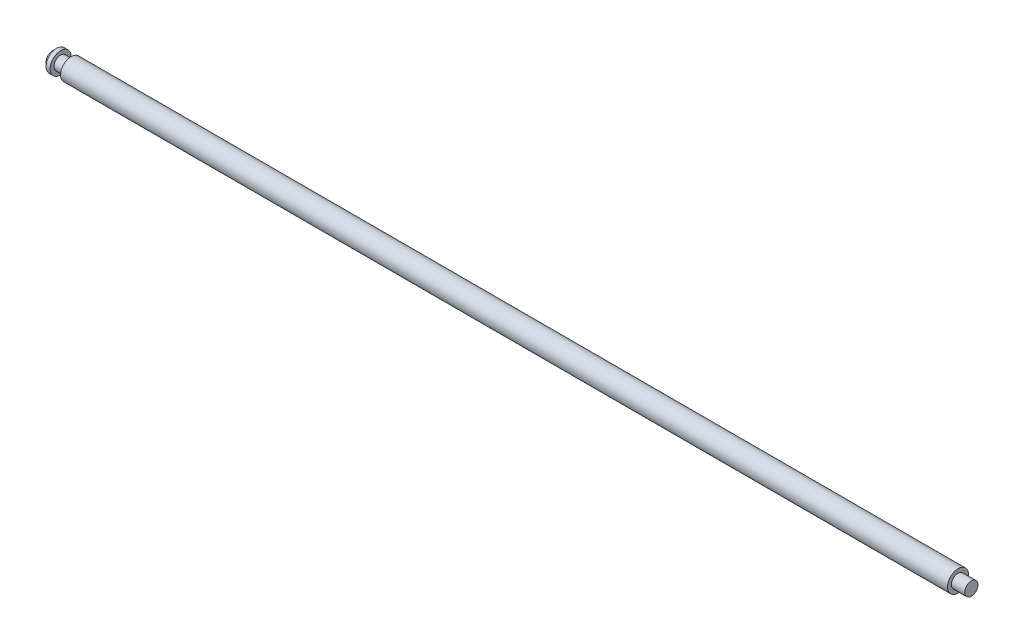
ISO-10303-21;
HEADER;
FILE_DESCRIPTION(('STEP AP214'),'2;1');
FILE_NAME('part.step','',(''),(''),'','','');
FILE_SCHEMA(('AUTOMOTIVE_DESIGN { 1 0 10303 214 1 1 1 1 }'));
ENDSEC;
DATA;
#1=APPLICATION_CONTEXT('core data for automotive mechanical design processes');
#2=APPLICATION_PROTOCOL_DEFINITION('international standard','automotive_design',2000,#1);
#3=PRODUCT_CONTEXT('',#1,'mechanical');
#4=PRODUCT('Part','Part','',(#3));
#5=PRODUCT_RELATED_PRODUCT_CATEGORY('part','',(#4));
#6=PRODUCT_DEFINITION_FORMATION('','',#4);
#7=PRODUCT_DEFINITION_CONTEXT('part definition',#1,'design');
#8=PRODUCT_DEFINITION('design','',#6,#7);
#9=PRODUCT_DEFINITION_SHAPE('','',#8);
#10=(LENGTH_UNIT() NAMED_UNIT(*) SI_UNIT(.MILLI.,.METRE.));
#11=(NAMED_UNIT(*) PLANE_ANGLE_UNIT() SI_UNIT($,.RADIAN.));
#12=(NAMED_UNIT(*) SI_UNIT($,.STERADIAN.) SOLID_ANGLE_UNIT());
#13=UNCERTAINTY_MEASURE_WITH_UNIT(LENGTH_MEASURE(1.E-05),#10,'distance_accuracy_value','');
#14=(GEOMETRIC_REPRESENTATION_CONTEXT(3) GLOBAL_UNCERTAINTY_ASSIGNED_CONTEXT((#13)) GLOBAL_UNIT_ASSIGNED_CONTEXT((#10,
#11,#12)) REPRESENTATION_CONTEXT('',''));
#15=CARTESIAN_POINT('',(0.,0.,0.));
#16=DIRECTION('',(0.,0.,1.));
#17=DIRECTION('',(1.,0.,0.));
#18=AXIS2_PLACEMENT_3D('',#15,#16,#17);
#19=CARTESIAN_POINT('',(-204.15,0.,-3.00000000000003));
#20=DIRECTION('',(1.,0.,0.));
#21=DIRECTION('',(0.,0.,-1.));
#22=AXIS2_PLACEMENT_3D('',#19,#20,#21);
#23=PLANE('',#22);
#24=CARTESIAN_POINT('',(-204.15,0.,0.));
#25=DIRECTION('',(-1.,0.,0.));
#26=DIRECTION('',(0.,0.,1.));
#27=AXIS2_PLACEMENT_3D('',#24,#25,#26);
#28=CIRCLE('',#27,3.00000000000003);
#29=CARTESIAN_POINT('',(-204.15,0.,3.00000000000003));
#30=VERTEX_POINT('',#29);
#31=EDGE_CURVE('E10',#30,#30,#28,.T.);
#32=ORIENTED_EDGE('',*,*,#31,.T.);
#33=EDGE_LOOP('',(#32));
#34=FACE_BOUND('',#33,.T.);
#35=ADVANCED_FACE('F31',(#34),#23,.F.);
#36=CARTESIAN_POINT('',(-204.15,0.,0.));
#37=DIRECTION('',(-1.,0.,0.));
#38=DIRECTION('',(0.,0.,1.));
#39=AXIS2_PLACEMENT_3D('',#36,#37,#38);
#40=CYLINDRICAL_SURFACE('',#39,3.00000000000003);
#41=ORIENTED_EDGE('',*,*,#31,.F.);
#42=EDGE_LOOP('',(#41));
#43=FACE_BOUND('',#42,.T.);
#44=CARTESIAN_POINT('',(-202.4,0.,0.));
#45=DIRECTION('',(-1.,0.,0.));
#46=DIRECTION('',(0.,0.,1.));
#47=AXIS2_PLACEMENT_3D('',#44,#45,#46);
#48=CIRCLE('',#47,3.00000000000003);
#49=CARTESIAN_POINT('',(-202.4,0.,3.00000000000003));
#50=VERTEX_POINT('',#49);
#51=EDGE_CURVE('E37',#50,#50,#48,.T.);
#52=ORIENTED_EDGE('',*,*,#51,.T.);
#53=EDGE_LOOP('',(#52));
#54=FACE_BOUND('',#53,.T.);
#55=ADVANCED_FACE('F81',(#43,#54),#40,.T.);
#56=CARTESIAN_POINT('',(-202.4,0.,-4.76250000000004));
#57=DIRECTION('',(1.,0.,0.));
#58=DIRECTION('',(0.,0.,-1.));
#59=AXIS2_PLACEMENT_3D('',#56,#57,#58);
#60=PLANE('',#59);
#61=ORIENTED_EDGE('',*,*,#51,.F.);
#62=EDGE_LOOP('',(#61));
#63=FACE_BOUND('',#62,.T.);
#64=CARTESIAN_POINT('',(-202.4,0.,0.));
#65=DIRECTION('',(-1.,0.,0.));
#66=DIRECTION('',(0.,0.,1.));
#67=AXIS2_PLACEMENT_3D('',#64,#65,#66);
#68=CIRCLE('',#67,4.76250000000004);
#69=CARTESIAN_POINT('',(-202.4,0.,4.76250000000004));
#70=VERTEX_POINT('',#69);
#71=EDGE_CURVE('E41',#70,#70,#68,.T.);
#72=ORIENTED_EDGE('',*,*,#71,.T.);
#73=EDGE_LOOP('',(#72));
#74=FACE_BOUND('',#73,.T.);
#75=ADVANCED_FACE('F85',(#63,#74),#60,.F.);
#76=CARTESIAN_POINT('',(-204.15,0.,0.));
#77=DIRECTION('',(-1.,0.,0.));
#78=DIRECTION('',(0.,0.,1.));
#79=AXIS2_PLACEMENT_3D('',#76,#77,#78);
#80=CYLINDRICAL_SURFACE('',#79,4.76250000000004);
#81=ORIENTED_EDGE('',*,*,#71,.F.);
#82=EDGE_LOOP('',(#81));
#83=FACE_BOUND('',#82,.T.);
#84=CARTESIAN_POINT('',(-200.55,0.,0.));
#85=DIRECTION('',(-1.,0.,0.));
#86=DIRECTION('',(0.,0.,1.));
#87=AXIS2_PLACEMENT_3D('',#84,#85,#86);
#88=CIRCLE('',#87,4.76250000000004);
#89=CARTESIAN_POINT('',(-200.55,0.,4.76250000000004));
#90=VERTEX_POINT('',#89);
#91=EDGE_CURVE('E45',#90,#90,#88,.T.);
#92=ORIENTED_EDGE('',*,*,#91,.T.);
#93=EDGE_LOOP('',(#92));
#94=FACE_BOUND('',#93,.T.);
#95=ADVANCED_FACE('F90',(#83,#94),#80,.T.);
#96=CARTESIAN_POINT('',(-200.55,0.,-3.00000000000004));
#97=DIRECTION('',(-1.,0.,0.));
#98=DIRECTION('',(0.,0.,1.));
#99=AXIS2_PLACEMENT_3D('',#96,#97,#98);
#100=PLANE('',#99);
#101=ORIENTED_EDGE('',*,*,#91,.F.);
#102=EDGE_LOOP('',(#101));
#103=FACE_BOUND('',#102,.T.);
#104=CARTESIAN_POINT('',(-200.55,0.,0.));
#105=DIRECTION('',(-1.,0.,0.));
#106=DIRECTION('',(0.,0.,1.));
#107=AXIS2_PLACEMENT_3D('',#104,#105,#106);
#108=CIRCLE('',#107,3.00000000000004);
#109=CARTESIAN_POINT('',(-200.55,0.,3.00000000000004));
#110=VERTEX_POINT('',#109);
#111=EDGE_CURVE('E50',#110,#110,#108,.T.);
#112=ORIENTED_EDGE('',*,*,#111,.T.);
#113=EDGE_LOOP('',(#112));
#114=FACE_BOUND('',#113,.T.);
#115=ADVANCED_FACE('F96',(#103,#114),#100,.F.);
#116=CARTESIAN_POINT('',(-204.15,0.,0.));
#117=DIRECTION('',(-1.,0.,0.));
#118=DIRECTION('',(0.,0.,1.));
#119=AXIS2_PLACEMENT_3D('',#116,#117,#118);
#120=CYLINDRICAL_SURFACE('',#119,3.00000000000004);
#121=ORIENTED_EDGE('',*,*,#111,.F.);
#122=EDGE_LOOP('',(#121));
#123=FACE_BOUND('',#122,.T.);
#124=CARTESIAN_POINT('',(-195.85,0.,0.));
#125=DIRECTION('',(-1.,0.,0.));
#126=DIRECTION('',(0.,0.,1.));
#127=AXIS2_PLACEMENT_3D('',#124,#125,#126);
#128=CIRCLE('',#127,3.00000000000004);
#129=CARTESIAN_POINT('',(-195.85,0.,3.00000000000004));
#130=VERTEX_POINT('',#129);
#131=EDGE_CURVE('E53',#130,#130,#128,.T.);
#132=ORIENTED_EDGE('',*,*,#131,.T.);
#133=EDGE_LOOP('',(#132));
#134=FACE_BOUND('',#133,.T.);
#135=ADVANCED_FACE('F100',(#123,#134),#120,.T.);
#136=CARTESIAN_POINT('',(-195.85,0.,-4.76250000000003));
#137=DIRECTION('',(1.,0.,0.));
#138=DIRECTION('',(0.,0.,-1.));
#139=AXIS2_PLACEMENT_3D('',#136,#137,#138);
#140=PLANE('',#139);
#141=ORIENTED_EDGE('',*,*,#131,.F.);
#142=EDGE_LOOP('',(#141));
#143=FACE_BOUND('',#142,.T.);
#144=CARTESIAN_POINT('',(-195.85,0.,0.));
#145=DIRECTION('',(-1.,0.,0.));
#146=DIRECTION('',(0.,0.,1.));
#147=AXIS2_PLACEMENT_3D('',#144,#145,#146);
#148=CIRCLE('',#147,4.76250000000003);
#149=CARTESIAN_POINT('',(-195.85,0.,4.76250000000003));
#150=VERTEX_POINT('',#149);
#151=EDGE_CURVE('E56',#150,#150,#148,.T.);
#152=ORIENTED_EDGE('',*,*,#151,.T.);
#153=EDGE_LOOP('',(#152));
#154=FACE_BOUND('',#153,.T.);
#155=ADVANCED_FACE('F104',(#143,#154),#140,.F.);
#156=CARTESIAN_POINT('',(-204.15,0.,0.));
#157=DIRECTION('',(-1.,0.,0.));
#158=DIRECTION('',(0.,0.,1.));
#159=AXIS2_PLACEMENT_3D('',#156,#157,#158);
#160=CYLINDRICAL_SURFACE('',#159,4.7625);
#161=ORIENTED_EDGE('',*,*,#151,.F.);
#162=EDGE_LOOP('',(#161));
#163=FACE_BOUND('',#162,.T.);
#164=CARTESIAN_POINT('',(204.15,0.,0.));
#165=DIRECTION('',(-1.,0.,0.));
#166=DIRECTION('',(0.,0.,1.));
#167=AXIS2_PLACEMENT_3D('',#164,#165,#166);
#168=CIRCLE('',#167,4.76249999999996);
#169=CARTESIAN_POINT('',(204.15,0.,4.76249999999996));
#170=VERTEX_POINT('',#169);
#171=EDGE_CURVE('E59',#170,#170,#168,.T.);
#172=ORIENTED_EDGE('',*,*,#171,.T.);
#173=EDGE_LOOP('',(#172));
#174=FACE_BOUND('',#173,.T.);
#175=ADVANCED_FACE('F108',(#163,#174),#160,.T.);
#176=CARTESIAN_POINT('',(204.15,0.,-4.76249999999996));
#177=DIRECTION('',(-1.,0.,0.));
#178=DIRECTION('',(0.,0.,1.));
#179=AXIS2_PLACEMENT_3D('',#176,#177,#178);
#180=PLANE('',#179);
#181=ORIENTED_EDGE('',*,*,#171,.F.);
#182=EDGE_LOOP('',(#181));
#183=FACE_BOUND('',#182,.T.);
#184=CARTESIAN_POINT('',(204.15,0.,0.));
#185=DIRECTION('',(-1.,0.,0.));
#186=DIRECTION('',(0.,0.,1.));
#187=AXIS2_PLACEMENT_3D('',#184,#185,#186);
#188=CIRCLE('',#187,3.);
#189=CARTESIAN_POINT('',(204.15,0.,3.));
#190=VERTEX_POINT('',#189);
#191=EDGE_CURVE('E62',#190,#190,#188,.T.);
#192=ORIENTED_EDGE('',*,*,#191,.T.);
#193=EDGE_LOOP('',(#192));
#194=FACE_BOUND('',#193,.T.);
#195=ADVANCED_FACE('F77',(#183,#194),#180,.F.);
#196=CARTESIAN_POINT('',(-204.15,0.,0.));
#197=DIRECTION('',(-1.,0.,0.));
#198=DIRECTION('',(0.,0.,1.));
#199=AXIS2_PLACEMENT_3D('',#196,#197,#198);
#200=CYLINDRICAL_SURFACE('',#199,3.);
#201=ORIENTED_EDGE('',*,*,#191,.F.);
#202=EDGE_LOOP('',(#201));
#203=FACE_BOUND('',#202,.T.);
#204=CARTESIAN_POINT('',(210.15,0.,0.));
#205=DIRECTION('',(-1.,0.,0.));
#206=DIRECTION('',(0.,0.,1.));
#207=AXIS2_PLACEMENT_3D('',#204,#205,#206);
#208=CIRCLE('',#207,3.);
#209=CARTESIAN_POINT('',(210.15,0.,3.));
#210=VERTEX_POINT('',#209);
#211=EDGE_CURVE('E65',#210,#210,#208,.T.);
#212=ORIENTED_EDGE('',*,*,#211,.T.);
#213=EDGE_LOOP('',(#212));
#214=FACE_BOUND('',#213,.T.);
#215=ADVANCED_FACE('F69',(#203,#214),#200,.T.);
#216=CARTESIAN_POINT('',(210.15,0.,-3.));
#217=DIRECTION('',(-1.,0.,0.));
#218=DIRECTION('',(0.,0.,1.));
#219=AXIS2_PLACEMENT_3D('',#216,#217,#218);
#220=PLANE('',#219);
#221=ORIENTED_EDGE('',*,*,#211,.F.);
#222=EDGE_LOOP('',(#221));
#223=FACE_BOUND('',#222,.T.);
#224=ADVANCED_FACE('F71',(#223),#220,.F.);
#225=CLOSED_SHELL('',(#35,#55,#75,#95,#115,#135,#155,#175,#195,#215,#224));
#226=MANIFOLD_SOLID_BREP('B2',#225);
#227=ADVANCED_BREP_SHAPE_REPRESENTATION('',(#18,#226),#14);
#228=SHAPE_DEFINITION_REPRESENTATION(#9,#227);
ENDSEC;
END-ISO-10303-21;
